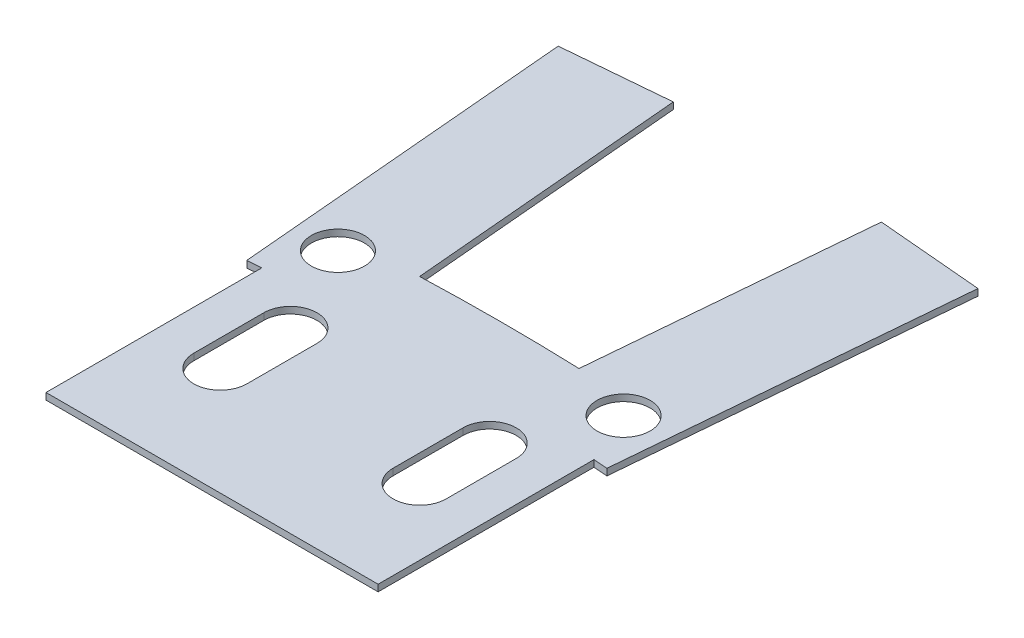
ISO-10303-21;
HEADER;
FILE_DESCRIPTION(('STEP AP214'),'2;1');
FILE_NAME('part.step','',(''),(''),'','','');
FILE_SCHEMA(('AUTOMOTIVE_DESIGN { 1 0 10303 214 1 1 1 1 }'));
ENDSEC;
DATA;
#1=APPLICATION_CONTEXT('core data for automotive mechanical design processes');
#2=APPLICATION_PROTOCOL_DEFINITION('international standard','automotive_design',2000,#1);
#3=PRODUCT_CONTEXT('',#1,'mechanical');
#4=PRODUCT('Part','Part','',(#3));
#5=PRODUCT_RELATED_PRODUCT_CATEGORY('part','',(#4));
#6=PRODUCT_DEFINITION_FORMATION('','',#4);
#7=PRODUCT_DEFINITION_CONTEXT('part definition',#1,'design');
#8=PRODUCT_DEFINITION('design','',#6,#7);
#9=PRODUCT_DEFINITION_SHAPE('','',#8);
#10=(LENGTH_UNIT() NAMED_UNIT(*) SI_UNIT(.MILLI.,.METRE.));
#11=(NAMED_UNIT(*) PLANE_ANGLE_UNIT() SI_UNIT($,.RADIAN.));
#12=(NAMED_UNIT(*) SI_UNIT($,.STERADIAN.) SOLID_ANGLE_UNIT());
#13=UNCERTAINTY_MEASURE_WITH_UNIT(LENGTH_MEASURE(1.E-05),#10,'distance_accuracy_value','');
#14=(GEOMETRIC_REPRESENTATION_CONTEXT(3) GLOBAL_UNCERTAINTY_ASSIGNED_CONTEXT((#13)) GLOBAL_UNIT_ASSIGNED_CONTEXT((#10,
#11,#12)) REPRESENTATION_CONTEXT('',''));
#15=CARTESIAN_POINT('',(0.,0.,0.));
#16=DIRECTION('',(0.,0.,1.));
#17=DIRECTION('',(1.,0.,0.));
#18=AXIS2_PLACEMENT_3D('',#15,#16,#17);
#19=CARTESIAN_POINT('',(0.,0.5,0.));
#20=DIRECTION('',(0.,-1.,0.));
#21=DIRECTION('',(0.,0.,-1.));
#22=AXIS2_PLACEMENT_3D('',#19,#20,#21);
#23=PLANE('',#22);
#24=CARTESIAN_POINT('',(21.4999999999977,0.5,-333.754934474164));
#25=DIRECTION('',(0.,1.,0.));
#26=DIRECTION('',(0.,0.,-1.));
#27=AXIS2_PLACEMENT_3D('',#24,#25,#26);
#28=CIRCLE('',#27,4.00000000000001);
#29=CARTESIAN_POINT('',(21.4999999999977,0.5,-337.754934474164));
#30=VERTEX_POINT('',#29);
#31=EDGE_CURVE('E225',#30,#30,#28,.T.);
#32=ORIENTED_EDGE('',*,*,#31,.F.);
#33=EDGE_LOOP('',(#32));
#34=FACE_BOUND('',#33,.T.);
#35=CARTESIAN_POINT('',(-21.5,0.5,-333.754934474164));
#36=DIRECTION('',(0.,1.,0.));
#37=DIRECTION('',(0.,0.,1.));
#38=AXIS2_PLACEMENT_3D('',#35,#36,#37);
#39=CIRCLE('',#38,4.);
#40=CARTESIAN_POINT('',(-21.5,0.5,-329.754934474164));
#41=VERTEX_POINT('',#40);
#42=EDGE_CURVE('E233',#41,#41,#39,.T.);
#43=ORIENTED_EDGE('',*,*,#42,.F.);
#44=EDGE_LOOP('',(#43));
#45=FACE_BOUND('',#44,.T.);
#46=CARTESIAN_POINT('',(14.9999999999979,0.5,-309.554578987644));
#47=DIRECTION('',(0.,1.,0.));
#48=DIRECTION('',(0.,0.,-1.));
#49=AXIS2_PLACEMENT_3D('',#46,#47,#48);
#50=CIRCLE('',#49,4.00000000000001);
#51=CARTESIAN_POINT('',(10.9999999999979,0.5,-309.554578987644));
#52=VERTEX_POINT('',#51);
#53=CARTESIAN_POINT('',(18.9999999999979,0.5,-309.554578987644));
#54=VERTEX_POINT('',#53);
#55=EDGE_CURVE('E241',#52,#54,#50,.T.);
#56=ORIENTED_EDGE('',*,*,#55,.F.);
#57=DIRECTION('',(0.,0.,1.));
#58=VECTOR('',#57,1.);
#59=CARTESIAN_POINT('',(10.9999999999978,0.5,-320.098149951301));
#60=LINE('',#59,#58);
#61=CARTESIAN_POINT('',(10.9999999999978,0.5,-320.098149951301));
#62=VERTEX_POINT('',#61);
#63=EDGE_CURVE('E252',#62,#52,#60,.T.);
#64=ORIENTED_EDGE('',*,*,#63,.F.);
#65=CARTESIAN_POINT('',(14.9999999999978,0.5,-320.098149951301));
#66=DIRECTION('',(0.,1.,0.));
#67=DIRECTION('',(0.,0.,-1.));
#68=AXIS2_PLACEMENT_3D('',#65,#66,#67);
#69=CIRCLE('',#68,4.);
#70=CARTESIAN_POINT('',(18.9999999999978,0.5,-320.098149951301));
#71=VERTEX_POINT('',#70);
#72=EDGE_CURVE('E248',#71,#62,#69,.T.);
#73=ORIENTED_EDGE('',*,*,#72,.F.);
#74=DIRECTION('',(0.,0.,-1.));
#75=VECTOR('',#74,1.);
#76=CARTESIAN_POINT('',(18.9999999999978,0.5,-320.098149951301));
#77=LINE('',#76,#75);
#78=EDGE_CURVE('E244',#54,#71,#77,.T.);
#79=ORIENTED_EDGE('',*,*,#78,.F.);
#80=EDGE_LOOP('',(#56,#64,#73,#79));
#81=FACE_BOUND('',#80,.T.);
#82=CARTESIAN_POINT('',(0.,0.5,0.));
#83=DIRECTION('',(0.,-1.,0.));
#84=DIRECTION('',(0.,0.,-1.));
#85=AXIS2_PLACEMENT_3D('',#82,#83,#84);
#86=CIRCLE('',#85,326.762335175454);
#87=CARTESIAN_POINT('',(25.,0.5,-325.804578987644));
#88=VERTEX_POINT('',#87);
#89=CARTESIAN_POINT('',(27.1064085820858,0.5,-325.636094902111));
#90=VERTEX_POINT('',#89);
#91=EDGE_CURVE('E284',#88,#90,#86,.T.);
#92=ORIENTED_EDGE('',*,*,#91,.T.);
#93=DIRECTION('',(0.0871557427476582,0.,-0.996194698091745));
#94=VECTOR('',#93,1.);
#95=CARTESIAN_POINT('',(27.1064085820858,0.5,-325.636094902111));
#96=LINE('',#95,#94);
#97=CARTESIAN_POINT('',(31.6014869670453,0.5,-377.015075947211));
#98=VERTEX_POINT('',#97);
#99=EDGE_CURVE('E288',#90,#98,#96,.T.);
#100=ORIENTED_EDGE('',*,*,#99,.T.);
#101=DIRECTION('',(-0.996194698091746,0.,-0.087155742747657));
#102=VECTOR('',#101,1.);
#103=CARTESIAN_POINT('',(31.6014869670453,0.5,-377.015075947211));
#104=LINE('',#103,#102);
#105=CARTESIAN_POINT('',(15.6623717975774,0.5,-378.409567831173));
#106=VERTEX_POINT('',#105);
#107=EDGE_CURVE('E292',#98,#106,#104,.T.);
#108=ORIENTED_EDGE('',*,*,#107,.T.);
#109=DIRECTION('',(-0.0871557427476584,0.,0.996194698091746));
#110=VECTOR('',#109,1.);
#111=CARTESIAN_POINT('',(15.6623717975774,0.5,-378.409567831173));
#112=LINE('',#111,#110);
#113=CARTESIAN_POINT('',(12.,0.5,-336.548466632705));
#114=VERTEX_POINT('',#113);
#115=EDGE_CURVE('E295',#106,#114,#112,.T.);
#116=ORIENTED_EDGE('',*,*,#115,.T.);
#117=CARTESIAN_POINT('',(0.,0.5,0.));
#118=DIRECTION('',(0.,1.,0.));
#119=DIRECTION('',(0.,0.,1.));
#120=AXIS2_PLACEMENT_3D('',#117,#118,#119);
#121=CIRCLE('',#120,336.762335175454);
#122=CARTESIAN_POINT('',(-11.9999999999999,0.5,-336.548466632705));
#123=VERTEX_POINT('',#122);
#124=EDGE_CURVE('E298',#114,#123,#121,.T.);
#125=ORIENTED_EDGE('',*,*,#124,.T.);
#126=DIRECTION('',(-0.0871557427476584,0.,-0.996194698091746));
#127=VECTOR('',#126,1.);
#128=CARTESIAN_POINT('',(-15.6623717975774,0.5,-378.409567831173));
#129=LINE('',#128,#127);
#130=CARTESIAN_POINT('',(-15.6623717975774,0.5,-378.409567831173));
#131=VERTEX_POINT('',#130);
#132=EDGE_CURVE('E301',#123,#131,#129,.T.);
#133=ORIENTED_EDGE('',*,*,#132,.T.);
#134=DIRECTION('',(-0.996194698091746,0.,0.087155742747657));
#135=VECTOR('',#134,1.);
#136=CARTESIAN_POINT('',(-31.6014869670453,0.5,-377.015075947211));
#137=LINE('',#136,#135);
#138=CARTESIAN_POINT('',(-31.6014869670453,0.5,-377.015075947211));
#139=VERTEX_POINT('',#138);
#140=EDGE_CURVE('E304',#131,#139,#137,.T.);
#141=ORIENTED_EDGE('',*,*,#140,.T.);
#142=DIRECTION('',(0.0871557427476582,0.,0.996194698091745));
#143=VECTOR('',#142,1.);
#144=CARTESIAN_POINT('',(-27.9469910523665,0.5,-335.243996502204));
#145=LINE('',#144,#143);
#146=CARTESIAN_POINT('',(-27.1064085820858,0.5,-325.636094902111));
#147=VERTEX_POINT('',#146);
#148=EDGE_CURVE('E307',#139,#147,#145,.T.);
#149=ORIENTED_EDGE('',*,*,#148,.T.);
#150=CARTESIAN_POINT('',(0.,0.5,0.));
#151=DIRECTION('',(0.,-1.,0.));
#152=DIRECTION('',(0.,0.,1.));
#153=AXIS2_PLACEMENT_3D('',#150,#151,#152);
#154=CIRCLE('',#153,326.762335175454);
#155=CARTESIAN_POINT('',(-24.9999999999999,0.5,-325.804578987644));
#156=VERTEX_POINT('',#155);
#157=EDGE_CURVE('E310',#147,#156,#154,.T.);
#158=ORIENTED_EDGE('',*,*,#157,.T.);
#159=DIRECTION('',(0.,0.,1.));
#160=VECTOR('',#159,1.);
#161=CARTESIAN_POINT('',(-25.,0.5,-325.804578987644));
#162=LINE('',#161,#160);
#163=CARTESIAN_POINT('',(-25.,0.5,-293.304578987644));
#164=VERTEX_POINT('',#163);
#165=EDGE_CURVE('E313',#156,#164,#162,.T.);
#166=ORIENTED_EDGE('',*,*,#165,.T.);
#167=DIRECTION('',(1.,0.,0.));
#168=VECTOR('',#167,1.);
#169=CARTESIAN_POINT('',(25.,0.5,-293.304578987644));
#170=LINE('',#169,#168);
#171=CARTESIAN_POINT('',(25.,0.5,-293.304578987644));
#172=VERTEX_POINT('',#171);
#173=EDGE_CURVE('E316',#164,#172,#170,.T.);
#174=ORIENTED_EDGE('',*,*,#173,.T.);
#175=DIRECTION('',(0.,0.,-1.));
#176=VECTOR('',#175,1.);
#177=CARTESIAN_POINT('',(25.,0.5,-325.804578987644));
#178=LINE('',#177,#176);
#179=EDGE_CURVE('E319',#172,#88,#178,.T.);
#180=ORIENTED_EDGE('',*,*,#179,.T.);
#181=EDGE_LOOP('',(#92,#100,#108,#116,#125,#133,#141,#149,#158,#166,#174,#180));
#182=FACE_BOUND('',#181,.T.);
#183=CARTESIAN_POINT('',(-15.,0.5,-320.098149951301));
#184=DIRECTION('',(0.,1.,0.));
#185=DIRECTION('',(0.,0.,1.));
#186=AXIS2_PLACEMENT_3D('',#183,#184,#185);
#187=CIRCLE('',#186,4.);
#188=CARTESIAN_POINT('',(-11.,0.5,-320.098149951301));
#189=VERTEX_POINT('',#188);
#190=CARTESIAN_POINT('',(-19.,0.5,-320.098149951301));
#191=VERTEX_POINT('',#190);
#192=EDGE_CURVE('E176',#189,#191,#187,.T.);
#193=ORIENTED_EDGE('',*,*,#192,.F.);
#194=DIRECTION('',(0.,0.,-1.));
#195=VECTOR('',#194,1.);
#196=CARTESIAN_POINT('',(-11.,0.5,-320.098149951301));
#197=LINE('',#196,#195);
#198=CARTESIAN_POINT('',(-11.,0.5,-309.554578987644));
#199=VERTEX_POINT('',#198);
#200=EDGE_CURVE('E204',#199,#189,#197,.T.);
#201=ORIENTED_EDGE('',*,*,#200,.F.);
#202=CARTESIAN_POINT('',(-15.,0.5,-309.554578987644));
#203=DIRECTION('',(0.,1.,0.));
#204=DIRECTION('',(0.,0.,1.));
#205=AXIS2_PLACEMENT_3D('',#202,#203,#204);
#206=CIRCLE('',#205,4.00000000000001);
#207=CARTESIAN_POINT('',(-19.,0.5,-309.554578987644));
#208=VERTEX_POINT('',#207);
#209=EDGE_CURVE('E198',#208,#199,#206,.T.);
#210=ORIENTED_EDGE('',*,*,#209,.F.);
#211=DIRECTION('',(0.,0.,1.));
#212=VECTOR('',#211,1.);
#213=CARTESIAN_POINT('',(-19.,0.5,-320.098149951301));
#214=LINE('',#213,#212);
#215=EDGE_CURVE('E185',#191,#208,#214,.T.);
#216=ORIENTED_EDGE('',*,*,#215,.F.);
#217=EDGE_LOOP('',(#193,#201,#210,#216));
#218=FACE_BOUND('',#217,.T.);
#219=ADVANCED_FACE('F38',(#34,#45,#81,#182,#218),#23,.F.);
#220=CARTESIAN_POINT('',(0.,-0.5,0.));
#221=DIRECTION('',(0.,-1.,0.));
#222=DIRECTION('',(0.,0.,-1.));
#223=AXIS2_PLACEMENT_3D('',#220,#221,#222);
#224=PLANE('',#223);
#225=CARTESIAN_POINT('',(-21.5,-0.5,-333.754934474164));
#226=DIRECTION('',(0.,1.,0.));
#227=DIRECTION('',(0.,0.,1.));
#228=AXIS2_PLACEMENT_3D('',#225,#226,#227);
#229=CIRCLE('',#228,4.);
#230=CARTESIAN_POINT('',(-21.5,-0.5,-329.754934474164));
#231=VERTEX_POINT('',#230);
#232=EDGE_CURVE('E229',#231,#231,#229,.T.);
#233=ORIENTED_EDGE('',*,*,#232,.T.);
#234=EDGE_LOOP('',(#233));
#235=FACE_BOUND('',#234,.T.);
#236=CARTESIAN_POINT('',(0.,-0.5,0.));
#237=DIRECTION('',(0.,-1.,0.));
#238=DIRECTION('',(0.,0.,-1.));
#239=AXIS2_PLACEMENT_3D('',#236,#237,#238);
#240=CIRCLE('',#239,326.762335175454);
#241=CARTESIAN_POINT('',(25.,-0.5,-325.804578987644));
#242=VERTEX_POINT('',#241);
#243=CARTESIAN_POINT('',(27.1064085820858,-0.5,-325.636094902111));
#244=VERTEX_POINT('',#243);
#245=EDGE_CURVE('E283',#242,#244,#240,.T.);
#246=ORIENTED_EDGE('',*,*,#245,.F.);
#247=DIRECTION('',(0.,0.,-1.));
#248=VECTOR('',#247,1.);
#249=CARTESIAN_POINT('',(25.,-0.5,-325.804578987644));
#250=LINE('',#249,#248);
#251=CARTESIAN_POINT('',(25.,-0.5,-293.304578987644));
#252=VERTEX_POINT('',#251);
#253=EDGE_CURVE('E289',#252,#242,#250,.T.);
#254=ORIENTED_EDGE('',*,*,#253,.F.);
#255=DIRECTION('',(1.,0.,0.));
#256=VECTOR('',#255,1.);
#257=CARTESIAN_POINT('',(25.,-0.5,-293.304578987644));
#258=LINE('',#257,#256);
#259=CARTESIAN_POINT('',(-25.,-0.5,-293.304578987644));
#260=VERTEX_POINT('',#259);
#261=EDGE_CURVE('E354',#260,#252,#258,.T.);
#262=ORIENTED_EDGE('',*,*,#261,.F.);
#263=DIRECTION('',(0.,0.,1.));
#264=VECTOR('',#263,1.);
#265=CARTESIAN_POINT('',(-25.,-0.5,-325.804578987644));
#266=LINE('',#265,#264);
#267=CARTESIAN_POINT('',(-24.9999999999999,-0.5,-325.804578987644));
#268=VERTEX_POINT('',#267);
#269=EDGE_CURVE('E351',#268,#260,#266,.T.);
#270=ORIENTED_EDGE('',*,*,#269,.F.);
#271=CARTESIAN_POINT('',(0.,-0.5,0.));
#272=DIRECTION('',(0.,-1.,0.));
#273=DIRECTION('',(0.,0.,1.));
#274=AXIS2_PLACEMENT_3D('',#271,#272,#273);
#275=CIRCLE('',#274,326.762335175454);
#276=CARTESIAN_POINT('',(-27.1064085820858,-0.5,-325.636094902111));
#277=VERTEX_POINT('',#276);
#278=EDGE_CURVE('E348',#277,#268,#275,.T.);
#279=ORIENTED_EDGE('',*,*,#278,.F.);
#280=DIRECTION('',(0.0871557427476582,0.,0.996194698091745));
#281=VECTOR('',#280,1.);
#282=CARTESIAN_POINT('',(-27.1064085820858,-0.5,-325.636094902111));
#283=LINE('',#282,#281);
#284=CARTESIAN_POINT('',(-31.6014869670453,-0.5,-377.015075947211));
#285=VERTEX_POINT('',#284);
#286=EDGE_CURVE('E345',#285,#277,#283,.T.);
#287=ORIENTED_EDGE('',*,*,#286,.F.);
#288=DIRECTION('',(-0.996194698091746,0.,0.087155742747657));
#289=VECTOR('',#288,1.);
#290=CARTESIAN_POINT('',(-31.6014869670453,-0.5,-377.015075947211));
#291=LINE('',#290,#289);
#292=CARTESIAN_POINT('',(-15.6623717975774,-0.5,-378.409567831173));
#293=VERTEX_POINT('',#292);
#294=EDGE_CURVE('E341',#293,#285,#291,.T.);
#295=ORIENTED_EDGE('',*,*,#294,.F.);
#296=DIRECTION('',(-0.0871557427476584,0.,-0.996194698091746));
#297=VECTOR('',#296,1.);
#298=CARTESIAN_POINT('',(-15.6623717975774,-0.5,-378.409567831173));
#299=LINE('',#298,#297);
#300=CARTESIAN_POINT('',(-11.9999999999999,-0.5,-336.548466632705));
#301=VERTEX_POINT('',#300);
#302=EDGE_CURVE('E338',#301,#293,#299,.T.);
#303=ORIENTED_EDGE('',*,*,#302,.F.);
#304=CARTESIAN_POINT('',(0.,-0.5,0.));
#305=DIRECTION('',(0.,1.,0.));
#306=DIRECTION('',(0.,0.,1.));
#307=AXIS2_PLACEMENT_3D('',#304,#305,#306);
#308=CIRCLE('',#307,336.762335175454);
#309=CARTESIAN_POINT('',(12.,-0.5,-336.548466632705));
#310=VERTEX_POINT('',#309);
#311=EDGE_CURVE('E335',#310,#301,#308,.T.);
#312=ORIENTED_EDGE('',*,*,#311,.F.);
#313=DIRECTION('',(-0.0871557427476584,0.,0.996194698091746));
#314=VECTOR('',#313,1.);
#315=CARTESIAN_POINT('',(15.6623717975774,-0.5,-378.409567831173));
#316=LINE('',#315,#314);
#317=CARTESIAN_POINT('',(15.6623717975774,-0.5,-378.409567831173));
#318=VERTEX_POINT('',#317);
#319=EDGE_CURVE('E332',#318,#310,#316,.T.);
#320=ORIENTED_EDGE('',*,*,#319,.F.);
#321=DIRECTION('',(-0.996194698091746,0.,-0.087155742747657));
#322=VECTOR('',#321,1.);
#323=CARTESIAN_POINT('',(31.6014869670453,-0.5,-377.015075947211));
#324=LINE('',#323,#322);
#325=CARTESIAN_POINT('',(31.6014869670453,-0.5,-377.015075947211));
#326=VERTEX_POINT('',#325);
#327=EDGE_CURVE('E329',#326,#318,#324,.T.);
#328=ORIENTED_EDGE('',*,*,#327,.F.);
#329=DIRECTION('',(0.0871557427476582,0.,-0.996194698091745));
#330=VECTOR('',#329,1.);
#331=CARTESIAN_POINT('',(27.9469910523665,-0.5,-335.243996502204));
#332=LINE('',#331,#330);
#333=EDGE_CURVE('E326',#244,#326,#332,.T.);
#334=ORIENTED_EDGE('',*,*,#333,.F.);
#335=EDGE_LOOP('',(#246,#254,#262,#270,#279,#287,#295,#303,#312,#320,#328,#334));
#336=FACE_BOUND('',#335,.T.);
#337=DIRECTION('',(0.,0.,1.));
#338=VECTOR('',#337,1.);
#339=CARTESIAN_POINT('',(10.9999999999978,-0.5,-320.098149951301));
#340=LINE('',#339,#338);
#341=CARTESIAN_POINT('',(10.9999999999978,-0.5,-320.098149951301));
#342=VERTEX_POINT('',#341);
#343=CARTESIAN_POINT('',(10.9999999999979,-0.5,-309.554578987644));
#344=VERTEX_POINT('',#343);
#345=EDGE_CURVE('E245',#342,#344,#340,.T.);
#346=ORIENTED_EDGE('',*,*,#345,.T.);
#347=CARTESIAN_POINT('',(14.9999999999979,-0.5,-309.554578987644));
#348=DIRECTION('',(0.,1.,0.));
#349=DIRECTION('',(0.,0.,-1.));
#350=AXIS2_PLACEMENT_3D('',#347,#348,#349);
#351=CIRCLE('',#350,4.00000000000001);
#352=CARTESIAN_POINT('',(18.9999999999979,-0.5,-309.554578987644));
#353=VERTEX_POINT('',#352);
#354=EDGE_CURVE('E237',#344,#353,#351,.T.);
#355=ORIENTED_EDGE('',*,*,#354,.T.);
#356=DIRECTION('',(0.,0.,-1.));
#357=VECTOR('',#356,1.);
#358=CARTESIAN_POINT('',(18.9999999999978,-0.5,-320.098149951301));
#359=LINE('',#358,#357);
#360=CARTESIAN_POINT('',(18.9999999999978,-0.5,-320.098149951301));
#361=VERTEX_POINT('',#360);
#362=EDGE_CURVE('E259',#353,#361,#359,.T.);
#363=ORIENTED_EDGE('',*,*,#362,.T.);
#364=CARTESIAN_POINT('',(14.9999999999978,-0.5,-320.098149951301));
#365=DIRECTION('',(0.,1.,0.));
#366=DIRECTION('',(0.,0.,-1.));
#367=AXIS2_PLACEMENT_3D('',#364,#365,#366);
#368=CIRCLE('',#367,4.);
#369=EDGE_CURVE('E263',#361,#342,#368,.T.);
#370=ORIENTED_EDGE('',*,*,#369,.T.);
#371=EDGE_LOOP('',(#346,#355,#363,#370));
#372=FACE_BOUND('',#371,.T.);
#373=CARTESIAN_POINT('',(21.4999999999977,-0.5,-333.754934474164));
#374=DIRECTION('',(0.,1.,0.));
#375=DIRECTION('',(0.,0.,-1.));
#376=AXIS2_PLACEMENT_3D('',#373,#374,#375);
#377=CIRCLE('',#376,4.00000000000001);
#378=CARTESIAN_POINT('',(21.4999999999977,-0.5,-337.754934474164));
#379=VERTEX_POINT('',#378);
#380=EDGE_CURVE('E194',#379,#379,#377,.T.);
#381=ORIENTED_EDGE('',*,*,#380,.T.);
#382=EDGE_LOOP('',(#381));
#383=FACE_BOUND('',#382,.T.);
#384=DIRECTION('',(0.,0.,-1.));
#385=VECTOR('',#384,1.);
#386=CARTESIAN_POINT('',(-11.,-0.5,-320.098149951301));
#387=LINE('',#386,#385);
#388=CARTESIAN_POINT('',(-11.,-0.5,-309.554578987644));
#389=VERTEX_POINT('',#388);
#390=CARTESIAN_POINT('',(-11.,-0.5,-320.098149951301));
#391=VERTEX_POINT('',#390);
#392=EDGE_CURVE('E186',#389,#391,#387,.T.);
#393=ORIENTED_EDGE('',*,*,#392,.T.);
#394=CARTESIAN_POINT('',(-15.,-0.5,-320.098149951301));
#395=DIRECTION('',(0.,1.,0.));
#396=DIRECTION('',(0.,0.,1.));
#397=AXIS2_PLACEMENT_3D('',#394,#395,#396);
#398=CIRCLE('',#397,4.);
#399=CARTESIAN_POINT('',(-19.,-0.5,-320.098149951301));
#400=VERTEX_POINT('',#399);
#401=EDGE_CURVE('E62',#391,#400,#398,.T.);
#402=ORIENTED_EDGE('',*,*,#401,.T.);
#403=DIRECTION('',(0.,0.,1.));
#404=VECTOR('',#403,1.);
#405=CARTESIAN_POINT('',(-19.,-0.5,-320.098149951301));
#406=LINE('',#405,#404);
#407=CARTESIAN_POINT('',(-19.,-0.5,-309.554578987644));
#408=VERTEX_POINT('',#407);
#409=EDGE_CURVE('E192',#400,#408,#406,.T.);
#410=ORIENTED_EDGE('',*,*,#409,.T.);
#411=CARTESIAN_POINT('',(-15.,-0.5,-309.554578987644));
#412=DIRECTION('',(0.,1.,0.));
#413=DIRECTION('',(0.,0.,1.));
#414=AXIS2_PLACEMENT_3D('',#411,#412,#413);
#415=CIRCLE('',#414,4.00000000000001);
#416=EDGE_CURVE('E212',#408,#389,#415,.T.);
#417=ORIENTED_EDGE('',*,*,#416,.T.);
#418=EDGE_LOOP('',(#393,#402,#410,#417));
#419=FACE_BOUND('',#418,.T.);
#420=ADVANCED_FACE('F410',(#235,#336,#372,#383,#419),#224,.T.);
#421=CARTESIAN_POINT('',(0.,0.5,0.));
#422=DIRECTION('',(0.,-1.,0.));
#423=DIRECTION('',(0.,0.,-1.));
#424=AXIS2_PLACEMENT_3D('',#421,#422,#423);
#425=CYLINDRICAL_SURFACE('',#424,326.762335175454);
#426=ORIENTED_EDGE('',*,*,#245,.T.);
#427=DIRECTION('',(0.,-1.,0.));
#428=VECTOR('',#427,1.);
#429=CARTESIAN_POINT('',(27.1064085820858,0.5,-325.636094902111));
#430=LINE('',#429,#428);
#431=EDGE_CURVE('E11',#90,#244,#430,.T.);
#432=ORIENTED_EDGE('',*,*,#431,.F.);
#433=ORIENTED_EDGE('',*,*,#91,.F.);
#434=DIRECTION('',(0.,-1.,0.));
#435=VECTOR('',#434,1.);
#436=CARTESIAN_POINT('',(25.,0.5,-325.804578987644));
#437=LINE('',#436,#435);
#438=EDGE_CURVE('E322',#88,#242,#437,.T.);
#439=ORIENTED_EDGE('',*,*,#438,.T.);
#440=EDGE_LOOP('',(#426,#432,#433,#439));
#441=FACE_BOUND('',#440,.T.);
#442=ADVANCED_FACE('F40',(#441),#425,.F.);
#443=CARTESIAN_POINT('',(27.9469910523665,0.5,-335.243996502204));
#444=DIRECTION('',(-0.996194698091746,0.,-0.0871557427476582));
#445=DIRECTION('',(-0.0871557427476582,0.,0.996194698091746));
#446=AXIS2_PLACEMENT_3D('',#443,#444,#445);
#447=PLANE('',#446);
#448=ORIENTED_EDGE('',*,*,#333,.T.);
#449=DIRECTION('',(0.,-1.,0.));
#450=VECTOR('',#449,1.);
#451=CARTESIAN_POINT('',(31.6014869670453,0.5,-377.015075947211));
#452=LINE('',#451,#450);
#453=EDGE_CURVE('E47',#98,#326,#452,.T.);
#454=ORIENTED_EDGE('',*,*,#453,.F.);
#455=ORIENTED_EDGE('',*,*,#99,.F.);
#456=ORIENTED_EDGE('',*,*,#431,.T.);
#457=EDGE_LOOP('',(#448,#454,#455,#456));
#458=FACE_BOUND('',#457,.T.);
#459=ADVANCED_FACE('F427',(#458),#447,.F.);
#460=CARTESIAN_POINT('',(31.6014869670453,0.5,-377.015075947211));
#461=DIRECTION('',(-0.087155742747657,0.,0.996194698091746));
#462=DIRECTION('',(0.996194698091746,0.,0.0871557427476571));
#463=AXIS2_PLACEMENT_3D('',#460,#461,#462);
#464=PLANE('',#463);
#465=ORIENTED_EDGE('',*,*,#327,.T.);
#466=DIRECTION('',(0.,-1.,0.));
#467=VECTOR('',#466,1.);
#468=CARTESIAN_POINT('',(15.6623717975774,0.5,-378.409567831173));
#469=LINE('',#468,#467);
#470=EDGE_CURVE('E394',#106,#318,#469,.T.);
#471=ORIENTED_EDGE('',*,*,#470,.F.);
#472=ORIENTED_EDGE('',*,*,#107,.F.);
#473=ORIENTED_EDGE('',*,*,#453,.T.);
#474=EDGE_LOOP('',(#465,#471,#472,#473));
#475=FACE_BOUND('',#474,.T.);
#476=ADVANCED_FACE('F404',(#475),#464,.F.);
#477=CARTESIAN_POINT('',(15.6623717975774,0.5,-378.409567831173));
#478=DIRECTION('',(0.996194698091746,0.,0.0871557427476584));
#479=DIRECTION('',(0.0871557427476584,0.,-0.996194698091746));
#480=AXIS2_PLACEMENT_3D('',#477,#478,#479);
#481=PLANE('',#480);
#482=ORIENTED_EDGE('',*,*,#319,.T.);
#483=DIRECTION('',(0.,-1.,0.));
#484=VECTOR('',#483,1.);
#485=CARTESIAN_POINT('',(12.,0.5,-336.548466632705));
#486=LINE('',#485,#484);
#487=EDGE_CURVE('E390',#114,#310,#486,.T.);
#488=ORIENTED_EDGE('',*,*,#487,.F.);
#489=ORIENTED_EDGE('',*,*,#115,.F.);
#490=ORIENTED_EDGE('',*,*,#470,.T.);
#491=EDGE_LOOP('',(#482,#488,#489,#490));
#492=FACE_BOUND('',#491,.T.);
#493=ADVANCED_FACE('F416',(#492),#481,.F.);
#494=CARTESIAN_POINT('',(0.,0.5,0.));
#495=DIRECTION('',(0.,-1.,0.));
#496=DIRECTION('',(0.,0.,-1.));
#497=AXIS2_PLACEMENT_3D('',#494,#495,#496);
#498=CYLINDRICAL_SURFACE('',#497,336.762335175454);
#499=ORIENTED_EDGE('',*,*,#311,.T.);
#500=DIRECTION('',(0.,-1.,0.));
#501=VECTOR('',#500,1.);
#502=CARTESIAN_POINT('',(-11.9999999999999,0.5,-336.548466632705));
#503=LINE('',#502,#501);
#504=EDGE_CURVE('E386',#123,#301,#503,.T.);
#505=ORIENTED_EDGE('',*,*,#504,.F.);
#506=ORIENTED_EDGE('',*,*,#124,.F.);
#507=ORIENTED_EDGE('',*,*,#487,.T.);
#508=EDGE_LOOP('',(#499,#505,#506,#507));
#509=FACE_BOUND('',#508,.T.);
#510=ADVANCED_FACE('F420',(#509),#498,.T.);
#511=CARTESIAN_POINT('',(-15.6623717975774,0.5,-378.409567831173));
#512=DIRECTION('',(-0.996194698091746,0.,0.0871557427476584));
#513=DIRECTION('',(0.0871557427476584,0.,0.996194698091746));
#514=AXIS2_PLACEMENT_3D('',#511,#512,#513);
#515=PLANE('',#514);
#516=ORIENTED_EDGE('',*,*,#302,.T.);
#517=DIRECTION('',(0.,-1.,0.));
#518=VECTOR('',#517,1.);
#519=CARTESIAN_POINT('',(-15.6623717975774,0.5,-378.409567831173));
#520=LINE('',#519,#518);
#521=EDGE_CURVE('E382',#131,#293,#520,.T.);
#522=ORIENTED_EDGE('',*,*,#521,.F.);
#523=ORIENTED_EDGE('',*,*,#132,.F.);
#524=ORIENTED_EDGE('',*,*,#504,.T.);
#525=EDGE_LOOP('',(#516,#522,#523,#524));
#526=FACE_BOUND('',#525,.T.);
#527=ADVANCED_FACE('F459',(#526),#515,.F.);
#528=CARTESIAN_POINT('',(-31.6014869670453,0.5,-377.015075947211));
#529=DIRECTION('',(0.087155742747657,0.,0.996194698091746));
#530=DIRECTION('',(0.996194698091746,0.,-0.0871557427476571));
#531=AXIS2_PLACEMENT_3D('',#528,#529,#530);
#532=PLANE('',#531);
#533=ORIENTED_EDGE('',*,*,#294,.T.);
#534=DIRECTION('',(0.,-1.,0.));
#535=VECTOR('',#534,1.);
#536=CARTESIAN_POINT('',(-31.6014869670453,0.5,-377.015075947211));
#537=LINE('',#536,#535);
#538=EDGE_CURVE('E378',#139,#285,#537,.T.);
#539=ORIENTED_EDGE('',*,*,#538,.F.);
#540=ORIENTED_EDGE('',*,*,#140,.F.);
#541=ORIENTED_EDGE('',*,*,#521,.T.);
#542=EDGE_LOOP('',(#533,#539,#540,#541));
#543=FACE_BOUND('',#542,.T.);
#544=ADVANCED_FACE('F457',(#543),#532,.F.);
#545=CARTESIAN_POINT('',(-27.1064085820858,0.5,-325.636094902111));
#546=DIRECTION('',(0.996194698091746,0.,-0.0871557427476582));
#547=DIRECTION('',(-0.0871557427476582,0.,-0.996194698091746));
#548=AXIS2_PLACEMENT_3D('',#545,#546,#547);
#549=PLANE('',#548);
#550=ORIENTED_EDGE('',*,*,#286,.T.);
#551=DIRECTION('',(0.,-1.,0.));
#552=VECTOR('',#551,1.);
#553=CARTESIAN_POINT('',(-27.1064085820858,0.5,-325.636094902111));
#554=LINE('',#553,#552);
#555=EDGE_CURVE('E374',#147,#277,#554,.T.);
#556=ORIENTED_EDGE('',*,*,#555,.F.);
#557=ORIENTED_EDGE('',*,*,#148,.F.);
#558=ORIENTED_EDGE('',*,*,#538,.T.);
#559=EDGE_LOOP('',(#550,#556,#557,#558));
#560=FACE_BOUND('',#559,.T.);
#561=ADVANCED_FACE('F453',(#560),#549,.F.);
#562=CARTESIAN_POINT('',(0.,0.5,0.));
#563=DIRECTION('',(0.,-1.,0.));
#564=DIRECTION('',(0.,0.,-1.));
#565=AXIS2_PLACEMENT_3D('',#562,#563,#564);
#566=CYLINDRICAL_SURFACE('',#565,326.762335175454);
#567=ORIENTED_EDGE('',*,*,#278,.T.);
#568=DIRECTION('',(0.,-1.,0.));
#569=VECTOR('',#568,1.);
#570=CARTESIAN_POINT('',(-24.9999999999999,0.5,-325.804578987644));
#571=LINE('',#570,#569);
#572=EDGE_CURVE('E370',#156,#268,#571,.T.);
#573=ORIENTED_EDGE('',*,*,#572,.F.);
#574=ORIENTED_EDGE('',*,*,#157,.F.);
#575=ORIENTED_EDGE('',*,*,#555,.T.);
#576=EDGE_LOOP('',(#567,#573,#574,#575));
#577=FACE_BOUND('',#576,.T.);
#578=ADVANCED_FACE('F448',(#577),#566,.F.);
#579=CARTESIAN_POINT('',(-25.,0.5,-325.804578987644));
#580=DIRECTION('',(1.,0.,0.));
#581=DIRECTION('',(0.,0.,-1.));
#582=AXIS2_PLACEMENT_3D('',#579,#580,#581);
#583=PLANE('',#582);
#584=ORIENTED_EDGE('',*,*,#269,.T.);
#585=DIRECTION('',(0.,-1.,0.));
#586=VECTOR('',#585,1.);
#587=CARTESIAN_POINT('',(-25.,0.5,-293.304578987644));
#588=LINE('',#587,#586);
#589=EDGE_CURVE('E366',#164,#260,#588,.T.);
#590=ORIENTED_EDGE('',*,*,#589,.F.);
#591=ORIENTED_EDGE('',*,*,#165,.F.);
#592=ORIENTED_EDGE('',*,*,#572,.T.);
#593=EDGE_LOOP('',(#584,#590,#591,#592));
#594=FACE_BOUND('',#593,.T.);
#595=ADVANCED_FACE('F443',(#594),#583,.F.);
#596=CARTESIAN_POINT('',(25.,0.5,-293.304578987644));
#597=DIRECTION('',(0.,0.,-1.));
#598=DIRECTION('',(-1.,0.,0.));
#599=AXIS2_PLACEMENT_3D('',#596,#597,#598);
#600=PLANE('',#599);
#601=ORIENTED_EDGE('',*,*,#261,.T.);
#602=DIRECTION('',(0.,-1.,0.));
#603=VECTOR('',#602,1.);
#604=CARTESIAN_POINT('',(25.,0.5,-293.304578987644));
#605=LINE('',#604,#603);
#606=EDGE_CURVE('E362',#172,#252,#605,.T.);
#607=ORIENTED_EDGE('',*,*,#606,.F.);
#608=ORIENTED_EDGE('',*,*,#173,.F.);
#609=ORIENTED_EDGE('',*,*,#589,.T.);
#610=EDGE_LOOP('',(#601,#607,#608,#609));
#611=FACE_BOUND('',#610,.T.);
#612=ADVANCED_FACE('F439',(#611),#600,.F.);
#613=CARTESIAN_POINT('',(25.,0.5,-325.804578987644));
#614=DIRECTION('',(-1.,0.,0.));
#615=DIRECTION('',(0.,0.,1.));
#616=AXIS2_PLACEMENT_3D('',#613,#614,#615);
#617=PLANE('',#616);
#618=ORIENTED_EDGE('',*,*,#253,.T.);
#619=ORIENTED_EDGE('',*,*,#438,.F.);
#620=ORIENTED_EDGE('',*,*,#179,.F.);
#621=ORIENTED_EDGE('',*,*,#606,.T.);
#622=EDGE_LOOP('',(#618,#619,#620,#621));
#623=FACE_BOUND('',#622,.T.);
#624=ADVANCED_FACE('F434',(#623),#617,.F.);
#625=CARTESIAN_POINT('',(14.9999999999979,0.5,-309.554578987644));
#626=DIRECTION('',(0.,-1.,0.));
#627=DIRECTION('',(0.,0.,-1.));
#628=AXIS2_PLACEMENT_3D('',#625,#626,#627);
#629=CYLINDRICAL_SURFACE('',#628,4.00000000000001);
#630=ORIENTED_EDGE('',*,*,#354,.F.);
#631=DIRECTION('',(0.,-1.,0.));
#632=VECTOR('',#631,1.);
#633=CARTESIAN_POINT('',(10.9999999999979,0.5,-309.554578987644));
#634=LINE('',#633,#632);
#635=EDGE_CURVE('E255',#52,#344,#634,.T.);
#636=ORIENTED_EDGE('',*,*,#635,.F.);
#637=ORIENTED_EDGE('',*,*,#55,.T.);
#638=DIRECTION('',(0.,-1.,0.));
#639=VECTOR('',#638,1.);
#640=CARTESIAN_POINT('',(18.9999999999979,0.5,-309.554578987644));
#641=LINE('',#640,#639);
#642=EDGE_CURVE('E279',#54,#353,#641,.T.);
#643=ORIENTED_EDGE('',*,*,#642,.T.);
#644=EDGE_LOOP('',(#630,#636,#637,#643));
#645=FACE_BOUND('',#644,.T.);
#646=ADVANCED_FACE('F479',(#645),#629,.F.);
#647=CARTESIAN_POINT('',(18.9999999999978,0.5,-320.098149951301));
#648=DIRECTION('',(-1.,0.,0.));
#649=DIRECTION('',(0.,0.,1.));
#650=AXIS2_PLACEMENT_3D('',#647,#648,#649);
#651=PLANE('',#650);
#652=ORIENTED_EDGE('',*,*,#362,.F.);
#653=ORIENTED_EDGE('',*,*,#642,.F.);
#654=ORIENTED_EDGE('',*,*,#78,.T.);
#655=DIRECTION('',(0.,-1.,0.));
#656=VECTOR('',#655,1.);
#657=CARTESIAN_POINT('',(18.9999999999978,0.5,-320.098149951301));
#658=LINE('',#657,#656);
#659=EDGE_CURVE('E276',#71,#361,#658,.T.);
#660=ORIENTED_EDGE('',*,*,#659,.T.);
#661=EDGE_LOOP('',(#652,#653,#654,#660));
#662=FACE_BOUND('',#661,.T.);
#663=ADVANCED_FACE('F518',(#662),#651,.T.);
#664=CARTESIAN_POINT('',(14.9999999999978,0.5,-320.098149951301));
#665=DIRECTION('',(0.,-1.,0.));
#666=DIRECTION('',(0.,0.,-1.));
#667=AXIS2_PLACEMENT_3D('',#664,#665,#666);
#668=CYLINDRICAL_SURFACE('',#667,4.);
#669=ORIENTED_EDGE('',*,*,#369,.F.);
#670=ORIENTED_EDGE('',*,*,#659,.F.);
#671=ORIENTED_EDGE('',*,*,#72,.T.);
#672=DIRECTION('',(0.,-1.,0.));
#673=VECTOR('',#672,1.);
#674=CARTESIAN_POINT('',(10.9999999999978,0.5,-320.098149951301));
#675=LINE('',#674,#673);
#676=EDGE_CURVE('E273',#62,#342,#675,.T.);
#677=ORIENTED_EDGE('',*,*,#676,.T.);
#678=EDGE_LOOP('',(#669,#670,#671,#677));
#679=FACE_BOUND('',#678,.T.);
#680=ADVANCED_FACE('F526',(#679),#668,.F.);
#681=CARTESIAN_POINT('',(10.9999999999978,0.5,-320.098149951301));
#682=DIRECTION('',(1.,0.,0.));
#683=DIRECTION('',(0.,0.,-1.));
#684=AXIS2_PLACEMENT_3D('',#681,#682,#683);
#685=PLANE('',#684);
#686=ORIENTED_EDGE('',*,*,#345,.F.);
#687=ORIENTED_EDGE('',*,*,#676,.F.);
#688=ORIENTED_EDGE('',*,*,#63,.T.);
#689=ORIENTED_EDGE('',*,*,#635,.T.);
#690=EDGE_LOOP('',(#686,#687,#688,#689));
#691=FACE_BOUND('',#690,.T.);
#692=ADVANCED_FACE('F533',(#691),#685,.T.);
#693=CARTESIAN_POINT('',(-21.5,0.5,-333.754934474164));
#694=DIRECTION('',(0.,-1.,0.));
#695=DIRECTION('',(0.,0.,-1.));
#696=AXIS2_PLACEMENT_3D('',#693,#694,#695);
#697=CYLINDRICAL_SURFACE('',#696,4.);
#698=ORIENTED_EDGE('',*,*,#42,.T.);
#699=EDGE_LOOP('',(#698));
#700=FACE_BOUND('',#699,.T.);
#701=ORIENTED_EDGE('',*,*,#232,.F.);
#702=EDGE_LOOP('',(#701));
#703=FACE_BOUND('',#702,.T.);
#704=ADVANCED_FACE('F541',(#700,#703),#697,.F.);
#705=CARTESIAN_POINT('',(21.4999999999977,0.5,-333.754934474164));
#706=DIRECTION('',(0.,-1.,0.));
#707=DIRECTION('',(0.,0.,-1.));
#708=AXIS2_PLACEMENT_3D('',#705,#706,#707);
#709=CYLINDRICAL_SURFACE('',#708,4.00000000000001);
#710=ORIENTED_EDGE('',*,*,#31,.T.);
#711=EDGE_LOOP('',(#710));
#712=FACE_BOUND('',#711,.T.);
#713=ORIENTED_EDGE('',*,*,#380,.F.);
#714=EDGE_LOOP('',(#713));
#715=FACE_BOUND('',#714,.T.);
#716=ADVANCED_FACE('F550',(#712,#715),#709,.F.);
#717=CARTESIAN_POINT('',(-15.,0.5,-320.098149951301));
#718=DIRECTION('',(0.,-1.,0.));
#719=DIRECTION('',(0.,0.,-1.));
#720=AXIS2_PLACEMENT_3D('',#717,#718,#719);
#721=CYLINDRICAL_SURFACE('',#720,4.);
#722=ORIENTED_EDGE('',*,*,#401,.F.);
#723=DIRECTION('',(0.,-1.,0.));
#724=VECTOR('',#723,1.);
#725=CARTESIAN_POINT('',(-11.,0.5,-320.098149951301));
#726=LINE('',#725,#724);
#727=EDGE_CURVE('E180',#189,#391,#726,.T.);
#728=ORIENTED_EDGE('',*,*,#727,.F.);
#729=ORIENTED_EDGE('',*,*,#192,.T.);
#730=DIRECTION('',(0.,-1.,0.));
#731=VECTOR('',#730,1.);
#732=CARTESIAN_POINT('',(-19.,0.5,-320.098149951301));
#733=LINE('',#732,#731);
#734=EDGE_CURVE('E179',#191,#400,#733,.T.);
#735=ORIENTED_EDGE('',*,*,#734,.T.);
#736=EDGE_LOOP('',(#722,#728,#729,#735));
#737=FACE_BOUND('',#736,.T.);
#738=ADVANCED_FACE('F178',(#737),#721,.F.);
#739=CARTESIAN_POINT('',(-19.,0.5,-320.098149951301));
#740=DIRECTION('',(1.,0.,0.));
#741=DIRECTION('',(0.,0.,-1.));
#742=AXIS2_PLACEMENT_3D('',#739,#740,#741);
#743=PLANE('',#742);
#744=ORIENTED_EDGE('',*,*,#409,.F.);
#745=ORIENTED_EDGE('',*,*,#734,.F.);
#746=ORIENTED_EDGE('',*,*,#215,.T.);
#747=DIRECTION('',(0.,-1.,0.));
#748=VECTOR('',#747,1.);
#749=CARTESIAN_POINT('',(-19.,0.5,-309.554578987644));
#750=LINE('',#749,#748);
#751=EDGE_CURVE('E195',#208,#408,#750,.T.);
#752=ORIENTED_EDGE('',*,*,#751,.T.);
#753=EDGE_LOOP('',(#744,#745,#746,#752));
#754=FACE_BOUND('',#753,.T.);
#755=ADVANCED_FACE('F189',(#754),#743,.T.);
#756=CARTESIAN_POINT('',(-15.,0.5,-309.554578987644));
#757=DIRECTION('',(0.,-1.,0.));
#758=DIRECTION('',(0.,0.,-1.));
#759=AXIS2_PLACEMENT_3D('',#756,#757,#758);
#760=CYLINDRICAL_SURFACE('',#759,4.00000000000001);
#761=ORIENTED_EDGE('',*,*,#416,.F.);
#762=ORIENTED_EDGE('',*,*,#751,.F.);
#763=ORIENTED_EDGE('',*,*,#209,.T.);
#764=DIRECTION('',(0.,-1.,0.));
#765=VECTOR('',#764,1.);
#766=CARTESIAN_POINT('',(-11.,0.5,-309.554578987644));
#767=LINE('',#766,#765);
#768=EDGE_CURVE('E54',#199,#389,#767,.T.);
#769=ORIENTED_EDGE('',*,*,#768,.T.);
#770=EDGE_LOOP('',(#761,#762,#763,#769));
#771=FACE_BOUND('',#770,.T.);
#772=ADVANCED_FACE('F569',(#771),#760,.F.);
#773=CARTESIAN_POINT('',(-11.,0.5,-320.098149951301));
#774=DIRECTION('',(-1.,0.,0.));
#775=DIRECTION('',(0.,0.,1.));
#776=AXIS2_PLACEMENT_3D('',#773,#774,#775);
#777=PLANE('',#776);
#778=ORIENTED_EDGE('',*,*,#392,.F.);
#779=ORIENTED_EDGE('',*,*,#768,.F.);
#780=ORIENTED_EDGE('',*,*,#200,.T.);
#781=ORIENTED_EDGE('',*,*,#727,.T.);
#782=EDGE_LOOP('',(#778,#779,#780,#781));
#783=FACE_BOUND('',#782,.T.);
#784=ADVANCED_FACE('F576',(#783),#777,.T.);
#785=CLOSED_SHELL('',(#219,#420,#442,#459,#476,#493,#510,#527,#544,#561,#578,#595,#612,#624,
#646,#663,#680,#692,#704,#716,#738,#755,#772,#784));
#786=MANIFOLD_SOLID_BREP('B2',#785);
#787=ADVANCED_BREP_SHAPE_REPRESENTATION('',(#18,#786),#14);
#788=SHAPE_DEFINITION_REPRESENTATION(#9,#787);
ENDSEC;
END-ISO-10303-21;
